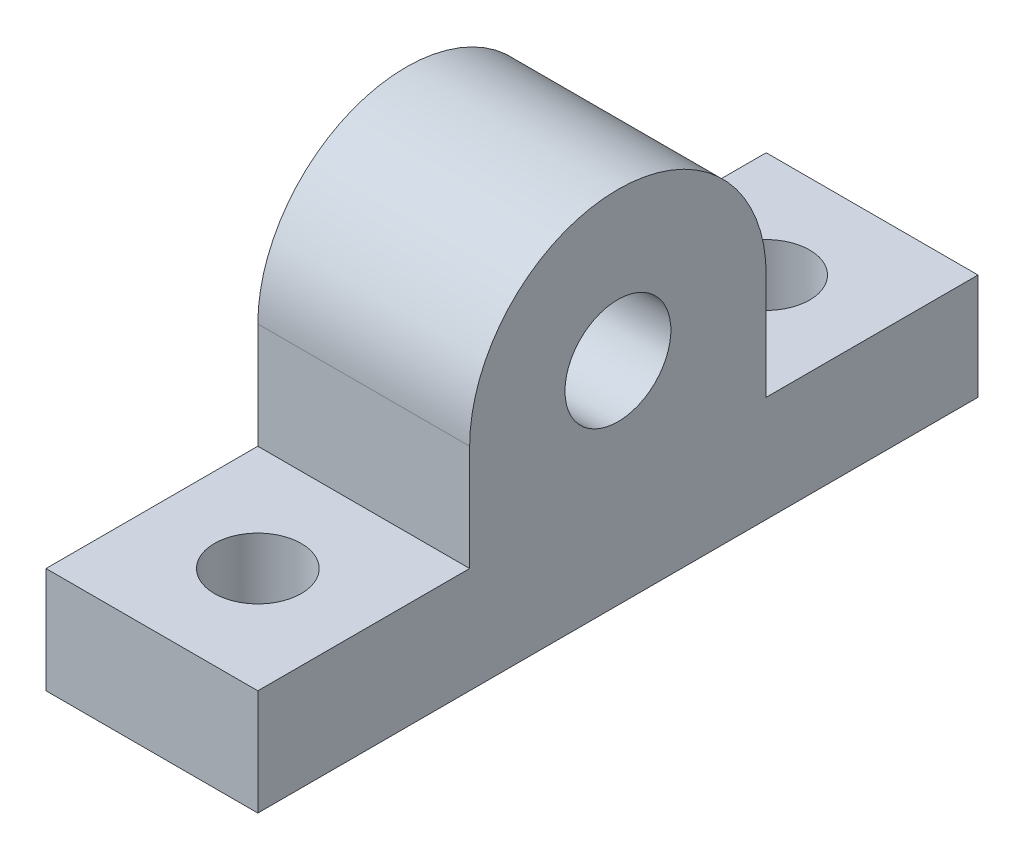
ISO-10303-21;
HEADER;
FILE_DESCRIPTION(('STEP AP214'),'2;1');
FILE_NAME('part.step','',(''),(''),'','','');
FILE_SCHEMA(('AUTOMOTIVE_DESIGN { 1 0 10303 214 1 1 1 1 }'));
ENDSEC;
DATA;
#1=APPLICATION_CONTEXT('core data for automotive mechanical design processes');
#2=APPLICATION_PROTOCOL_DEFINITION('international standard','automotive_design',2000,#1);
#3=PRODUCT_CONTEXT('',#1,'mechanical');
#4=PRODUCT('Part','Part','',(#3));
#5=PRODUCT_RELATED_PRODUCT_CATEGORY('part','',(#4));
#6=PRODUCT_DEFINITION_FORMATION('','',#4);
#7=PRODUCT_DEFINITION_CONTEXT('part definition',#1,'design');
#8=PRODUCT_DEFINITION('design','',#6,#7);
#9=PRODUCT_DEFINITION_SHAPE('','',#8);
#10=(LENGTH_UNIT() NAMED_UNIT(*) SI_UNIT(.MILLI.,.METRE.));
#11=(NAMED_UNIT(*) PLANE_ANGLE_UNIT() SI_UNIT($,.RADIAN.));
#12=(NAMED_UNIT(*) SI_UNIT($,.STERADIAN.) SOLID_ANGLE_UNIT());
#13=UNCERTAINTY_MEASURE_WITH_UNIT(LENGTH_MEASURE(1.E-05),#10,'distance_accuracy_value','');
#14=(GEOMETRIC_REPRESENTATION_CONTEXT(3) GLOBAL_UNCERTAINTY_ASSIGNED_CONTEXT((#13)) GLOBAL_UNIT_ASSIGNED_CONTEXT((#10,
#11,#12)) REPRESENTATION_CONTEXT('',''));
#15=CARTESIAN_POINT('',(0.,0.,0.));
#16=DIRECTION('',(0.,0.,1.));
#17=DIRECTION('',(1.,0.,0.));
#18=AXIS2_PLACEMENT_3D('',#15,#16,#17);
#19=CARTESIAN_POINT('',(10.,10.,0.));
#20=DIRECTION('',(-1.,0.,0.));
#21=DIRECTION('',(0.,0.,1.));
#22=AXIS2_PLACEMENT_3D('',#19,#20,#21);
#23=PLANE('',#22);
#24=DIRECTION('',(0.,-1.,0.));
#25=VECTOR('',#24,1.);
#26=CARTESIAN_POINT('',(10.,0.,17.));
#27=LINE('',#26,#25);
#28=CARTESIAN_POINT('',(10.,5.,17.));
#29=VERTEX_POINT('',#28);
#30=CARTESIAN_POINT('',(10.,0.,17.));
#31=VERTEX_POINT('',#30);
#32=EDGE_CURVE('E148',#29,#31,#27,.T.);
#33=ORIENTED_EDGE('',*,*,#32,.T.);
#34=DIRECTION('',(0.,0.,-1.));
#35=VECTOR('',#34,1.);
#36=CARTESIAN_POINT('',(10.,0.,-17.));
#37=LINE('',#36,#35);
#38=CARTESIAN_POINT('',(10.,0.,-17.));
#39=VERTEX_POINT('',#38);
#40=EDGE_CURVE('E96',#31,#39,#37,.T.);
#41=ORIENTED_EDGE('',*,*,#40,.T.);
#42=DIRECTION('',(0.,1.,0.));
#43=VECTOR('',#42,1.);
#44=CARTESIAN_POINT('',(10.,0.,-17.));
#45=LINE('',#44,#43);
#46=CARTESIAN_POINT('',(10.,5.,-17.));
#47=VERTEX_POINT('',#46);
#48=EDGE_CURVE('E180',#39,#47,#45,.T.);
#49=ORIENTED_EDGE('',*,*,#48,.T.);
#50=DIRECTION('',(0.,0.,1.));
#51=VECTOR('',#50,1.);
#52=CARTESIAN_POINT('',(10.,5.,-17.));
#53=LINE('',#52,#51);
#54=CARTESIAN_POINT('',(10.,5.,-7.));
#55=VERTEX_POINT('',#54);
#56=EDGE_CURVE('E182',#47,#55,#53,.T.);
#57=ORIENTED_EDGE('',*,*,#56,.T.);
#58=DIRECTION('',(0.,1.,0.));
#59=VECTOR('',#58,1.);
#60=CARTESIAN_POINT('',(10.,5.,-7.));
#61=LINE('',#60,#59);
#62=CARTESIAN_POINT('',(10.,10.,-7.));
#63=VERTEX_POINT('',#62);
#64=EDGE_CURVE('E115',#55,#63,#61,.T.);
#65=ORIENTED_EDGE('',*,*,#64,.T.);
#66=CARTESIAN_POINT('',(10.,10.,0.));
#67=DIRECTION('',(1.,0.,0.));
#68=DIRECTION('',(0.,0.,1.));
#69=AXIS2_PLACEMENT_3D('',#66,#67,#68);
#70=CIRCLE('',#69,7.);
#71=CARTESIAN_POINT('',(10.,10.,7.));
#72=VERTEX_POINT('',#71);
#73=EDGE_CURVE('E109',#63,#72,#70,.T.);
#74=ORIENTED_EDGE('',*,*,#73,.T.);
#75=DIRECTION('',(0.,-1.,0.));
#76=VECTOR('',#75,1.);
#77=CARTESIAN_POINT('',(10.,5.,7.));
#78=LINE('',#77,#76);
#79=CARTESIAN_POINT('',(10.,5.,7.));
#80=VERTEX_POINT('',#79);
#81=EDGE_CURVE('E113',#72,#80,#78,.T.);
#82=ORIENTED_EDGE('',*,*,#81,.T.);
#83=DIRECTION('',(0.,0.,1.));
#84=VECTOR('',#83,1.);
#85=CARTESIAN_POINT('',(10.,5.,17.));
#86=LINE('',#85,#84);
#87=EDGE_CURVE('E53',#80,#29,#86,.T.);
#88=ORIENTED_EDGE('',*,*,#87,.T.);
#89=EDGE_LOOP('',(#33,#41,#49,#57,#65,#74,#82,#88));
#90=FACE_BOUND('',#89,.T.);
#91=CARTESIAN_POINT('',(10.,10.,0.));
#92=DIRECTION('',(1.,0.,0.));
#93=DIRECTION('',(0.,0.,1.));
#94=AXIS2_PLACEMENT_3D('',#91,#92,#93);
#95=CIRCLE('',#94,2.5);
#96=CARTESIAN_POINT('',(10.,10.,2.5));
#97=VERTEX_POINT('',#96);
#98=EDGE_CURVE('E137',#97,#97,#95,.T.);
#99=ORIENTED_EDGE('',*,*,#98,.F.);
#100=EDGE_LOOP('',(#99));
#101=FACE_BOUND('',#100,.T.);
#102=ADVANCED_FACE('F34',(#90,#101),#23,.F.);
#103=CARTESIAN_POINT('',(0.,10.,0.));
#104=DIRECTION('',(-1.,0.,0.));
#105=DIRECTION('',(0.,0.,1.));
#106=AXIS2_PLACEMENT_3D('',#103,#104,#105);
#107=PLANE('',#106);
#108=DIRECTION('',(0.,-1.,0.));
#109=VECTOR('',#108,1.);
#110=CARTESIAN_POINT('',(0.,0.,17.));
#111=LINE('',#110,#109);
#112=CARTESIAN_POINT('',(0.,5.,17.));
#113=VERTEX_POINT('',#112);
#114=CARTESIAN_POINT('',(0.,0.,17.));
#115=VERTEX_POINT('',#114);
#116=EDGE_CURVE('E133',#113,#115,#111,.T.);
#117=ORIENTED_EDGE('',*,*,#116,.F.);
#118=DIRECTION('',(0.,0.,1.));
#119=VECTOR('',#118,1.);
#120=CARTESIAN_POINT('',(0.,5.,17.));
#121=LINE('',#120,#119);
#122=CARTESIAN_POINT('',(0.,5.,7.));
#123=VERTEX_POINT('',#122);
#124=EDGE_CURVE('E88',#123,#113,#121,.T.);
#125=ORIENTED_EDGE('',*,*,#124,.F.);
#126=DIRECTION('',(0.,-1.,0.));
#127=VECTOR('',#126,1.);
#128=CARTESIAN_POINT('',(0.,5.,7.));
#129=LINE('',#128,#127);
#130=CARTESIAN_POINT('',(0.,10.,7.));
#131=VERTEX_POINT('',#130);
#132=EDGE_CURVE('E82',#131,#123,#129,.T.);
#133=ORIENTED_EDGE('',*,*,#132,.F.);
#134=CARTESIAN_POINT('',(0.,10.,0.));
#135=DIRECTION('',(1.,0.,0.));
#136=DIRECTION('',(0.,0.,1.));
#137=AXIS2_PLACEMENT_3D('',#134,#135,#136);
#138=CIRCLE('',#137,7.);
#139=CARTESIAN_POINT('',(0.,10.,-7.));
#140=VERTEX_POINT('',#139);
#141=EDGE_CURVE('E123',#140,#131,#138,.T.);
#142=ORIENTED_EDGE('',*,*,#141,.F.);
#143=DIRECTION('',(0.,1.,0.));
#144=VECTOR('',#143,1.);
#145=CARTESIAN_POINT('',(0.,5.,-7.));
#146=LINE('',#145,#144);
#147=CARTESIAN_POINT('',(0.,5.,-7.));
#148=VERTEX_POINT('',#147);
#149=EDGE_CURVE('E143',#148,#140,#146,.T.);
#150=ORIENTED_EDGE('',*,*,#149,.F.);
#151=DIRECTION('',(0.,0.,1.));
#152=VECTOR('',#151,1.);
#153=CARTESIAN_POINT('',(0.,5.,-17.));
#154=LINE('',#153,#152);
#155=CARTESIAN_POINT('',(0.,5.,-17.));
#156=VERTEX_POINT('',#155);
#157=EDGE_CURVE('E141',#156,#148,#154,.T.);
#158=ORIENTED_EDGE('',*,*,#157,.F.);
#159=DIRECTION('',(0.,1.,0.));
#160=VECTOR('',#159,1.);
#161=CARTESIAN_POINT('',(0.,0.,-17.));
#162=LINE('',#161,#160);
#163=CARTESIAN_POINT('',(0.,0.,-17.));
#164=VERTEX_POINT('',#163);
#165=EDGE_CURVE('E139',#164,#156,#162,.T.);
#166=ORIENTED_EDGE('',*,*,#165,.F.);
#167=DIRECTION('',(0.,0.,-1.));
#168=VECTOR('',#167,1.);
#169=CARTESIAN_POINT('',(0.,0.,-17.));
#170=LINE('',#169,#168);
#171=EDGE_CURVE('E136',#115,#164,#170,.T.);
#172=ORIENTED_EDGE('',*,*,#171,.F.);
#173=EDGE_LOOP('',(#117,#125,#133,#142,#150,#158,#166,#172));
#174=FACE_BOUND('',#173,.T.);
#175=CARTESIAN_POINT('',(0.,10.,0.));
#176=DIRECTION('',(1.,0.,0.));
#177=DIRECTION('',(0.,0.,1.));
#178=AXIS2_PLACEMENT_3D('',#175,#176,#177);
#179=CIRCLE('',#178,2.5);
#180=CARTESIAN_POINT('',(0.,10.,2.5));
#181=VERTEX_POINT('',#180);
#182=EDGE_CURVE('E165',#181,#181,#179,.T.);
#183=ORIENTED_EDGE('',*,*,#182,.T.);
#184=EDGE_LOOP('',(#183));
#185=FACE_BOUND('',#184,.T.);
#186=ADVANCED_FACE('F195',(#174,#185),#107,.T.);
#187=CARTESIAN_POINT('',(10.,0.,17.));
#188=DIRECTION('',(0.,0.,-1.));
#189=DIRECTION('',(-1.,0.,0.));
#190=AXIS2_PLACEMENT_3D('',#187,#188,#189);
#191=PLANE('',#190);
#192=ORIENTED_EDGE('',*,*,#116,.T.);
#193=DIRECTION('',(-1.,0.,0.));
#194=VECTOR('',#193,1.);
#195=CARTESIAN_POINT('',(10.,0.,17.));
#196=LINE('',#195,#194);
#197=EDGE_CURVE('E11',#31,#115,#196,.T.);
#198=ORIENTED_EDGE('',*,*,#197,.F.);
#199=ORIENTED_EDGE('',*,*,#32,.F.);
#200=DIRECTION('',(-1.,0.,0.));
#201=VECTOR('',#200,1.);
#202=CARTESIAN_POINT('',(10.,5.,17.));
#203=LINE('',#202,#201);
#204=EDGE_CURVE('E129',#29,#113,#203,.T.);
#205=ORIENTED_EDGE('',*,*,#204,.T.);
#206=EDGE_LOOP('',(#192,#198,#199,#205));
#207=FACE_BOUND('',#206,.T.);
#208=ADVANCED_FACE('F36',(#207),#191,.F.);
#209=CARTESIAN_POINT('',(10.,0.,-17.));
#210=DIRECTION('',(0.,1.,0.));
#211=DIRECTION('',(0.,0.,1.));
#212=AXIS2_PLACEMENT_3D('',#209,#210,#211);
#213=PLANE('',#212);
#214=CARTESIAN_POINT('',(5.,0.,12.));
#215=DIRECTION('',(0.,1.,0.));
#216=DIRECTION('',(0.,0.,1.));
#217=AXIS2_PLACEMENT_3D('',#214,#215,#216);
#218=CIRCLE('',#217,2.05);
#219=CARTESIAN_POINT('',(5.,0.,14.05));
#220=VERTEX_POINT('',#219);
#221=EDGE_CURVE('E161',#220,#220,#218,.T.);
#222=ORIENTED_EDGE('',*,*,#221,.T.);
#223=EDGE_LOOP('',(#222));
#224=FACE_BOUND('',#223,.T.);
#225=CARTESIAN_POINT('',(5.,0.,-12.));
#226=DIRECTION('',(0.,1.,0.));
#227=DIRECTION('',(0.,0.,1.));
#228=AXIS2_PLACEMENT_3D('',#225,#226,#227);
#229=CIRCLE('',#228,2.05);
#230=CARTESIAN_POINT('',(5.,0.,-9.95));
#231=VERTEX_POINT('',#230);
#232=EDGE_CURVE('E167',#231,#231,#229,.T.);
#233=ORIENTED_EDGE('',*,*,#232,.T.);
#234=EDGE_LOOP('',(#233));
#235=FACE_BOUND('',#234,.T.);
#236=ORIENTED_EDGE('',*,*,#171,.T.);
#237=DIRECTION('',(-1.,0.,0.));
#238=VECTOR('',#237,1.);
#239=CARTESIAN_POINT('',(10.,0.,-17.));
#240=LINE('',#239,#238);
#241=EDGE_CURVE('E44',#39,#164,#240,.T.);
#242=ORIENTED_EDGE('',*,*,#241,.F.);
#243=ORIENTED_EDGE('',*,*,#40,.F.);
#244=ORIENTED_EDGE('',*,*,#197,.T.);
#245=EDGE_LOOP('',(#236,#242,#243,#244));
#246=FACE_BOUND('',#245,.T.);
#247=ADVANCED_FACE('F284',(#224,#235,#246),#213,.F.);
#248=CARTESIAN_POINT('',(10.,0.,-17.));
#249=DIRECTION('',(0.,0.,1.));
#250=DIRECTION('',(1.,0.,0.));
#251=AXIS2_PLACEMENT_3D('',#248,#249,#250);
#252=PLANE('',#251);
#253=ORIENTED_EDGE('',*,*,#165,.T.);
#254=DIRECTION('',(-1.,0.,0.));
#255=VECTOR('',#254,1.);
#256=CARTESIAN_POINT('',(10.,5.,-17.));
#257=LINE('',#256,#255);
#258=EDGE_CURVE('E155',#47,#156,#257,.T.);
#259=ORIENTED_EDGE('',*,*,#258,.F.);
#260=ORIENTED_EDGE('',*,*,#48,.F.);
#261=ORIENTED_EDGE('',*,*,#241,.T.);
#262=EDGE_LOOP('',(#253,#259,#260,#261));
#263=FACE_BOUND('',#262,.T.);
#264=ADVANCED_FACE('F276',(#263),#252,.F.);
#265=CARTESIAN_POINT('',(10.,5.,-17.));
#266=DIRECTION('',(0.,-1.,0.));
#267=DIRECTION('',(0.,0.,-1.));
#268=AXIS2_PLACEMENT_3D('',#265,#266,#267);
#269=PLANE('',#268);
#270=CARTESIAN_POINT('',(5.,5.,-12.));
#271=DIRECTION('',(0.,-1.,0.));
#272=DIRECTION('',(0.,0.,-1.));
#273=AXIS2_PLACEMENT_3D('',#270,#271,#272);
#274=CIRCLE('',#273,2.05);
#275=CARTESIAN_POINT('',(5.,5.,-14.05));
#276=VERTEX_POINT('',#275);
#277=EDGE_CURVE('E38',#276,#276,#274,.T.);
#278=ORIENTED_EDGE('',*,*,#277,.T.);
#279=EDGE_LOOP('',(#278));
#280=FACE_BOUND('',#279,.T.);
#281=ORIENTED_EDGE('',*,*,#157,.T.);
#282=DIRECTION('',(-1.,0.,0.));
#283=VECTOR('',#282,1.);
#284=CARTESIAN_POINT('',(10.,5.,-7.));
#285=LINE('',#284,#283);
#286=EDGE_CURVE('E152',#55,#148,#285,.T.);
#287=ORIENTED_EDGE('',*,*,#286,.F.);
#288=ORIENTED_EDGE('',*,*,#56,.F.);
#289=ORIENTED_EDGE('',*,*,#258,.T.);
#290=EDGE_LOOP('',(#281,#287,#288,#289));
#291=FACE_BOUND('',#290,.T.);
#292=ADVANCED_FACE('F188',(#280,#291),#269,.F.);
#293=CARTESIAN_POINT('',(10.,5.,-7.));
#294=DIRECTION('',(0.,0.,1.));
#295=DIRECTION('',(0.,-1.,0.));
#296=AXIS2_PLACEMENT_3D('',#293,#294,#295);
#297=PLANE('',#296);
#298=ORIENTED_EDGE('',*,*,#149,.T.);
#299=DIRECTION('',(-1.,0.,0.));
#300=VECTOR('',#299,1.);
#301=CARTESIAN_POINT('',(10.,10.,-7.));
#302=LINE('',#301,#300);
#303=EDGE_CURVE('E124',#63,#140,#302,.T.);
#304=ORIENTED_EDGE('',*,*,#303,.F.);
#305=ORIENTED_EDGE('',*,*,#64,.F.);
#306=ORIENTED_EDGE('',*,*,#286,.T.);
#307=EDGE_LOOP('',(#298,#304,#305,#306));
#308=FACE_BOUND('',#307,.T.);
#309=ADVANCED_FACE('F192',(#308),#297,.F.);
#310=CARTESIAN_POINT('',(10.,10.,0.));
#311=DIRECTION('',(-1.,0.,0.));
#312=DIRECTION('',(0.,0.,1.));
#313=AXIS2_PLACEMENT_3D('',#310,#311,#312);
#314=CYLINDRICAL_SURFACE('',#313,7.);
#315=ORIENTED_EDGE('',*,*,#141,.T.);
#316=DIRECTION('',(-1.,0.,0.));
#317=VECTOR('',#316,1.);
#318=CARTESIAN_POINT('',(10.,10.,7.));
#319=LINE('',#318,#317);
#320=EDGE_CURVE('E120',#72,#131,#319,.T.);
#321=ORIENTED_EDGE('',*,*,#320,.F.);
#322=ORIENTED_EDGE('',*,*,#73,.F.);
#323=ORIENTED_EDGE('',*,*,#303,.T.);
#324=EDGE_LOOP('',(#315,#321,#322,#323));
#325=FACE_BOUND('',#324,.T.);
#326=ADVANCED_FACE('F121',(#325),#314,.T.);
#327=CARTESIAN_POINT('',(10.,5.,7.));
#328=DIRECTION('',(0.,0.,-1.));
#329=DIRECTION('',(0.,1.,0.));
#330=AXIS2_PLACEMENT_3D('',#327,#328,#329);
#331=PLANE('',#330);
#332=ORIENTED_EDGE('',*,*,#132,.T.);
#333=DIRECTION('',(-1.,0.,0.));
#334=VECTOR('',#333,1.);
#335=CARTESIAN_POINT('',(10.,5.,7.));
#336=LINE('',#335,#334);
#337=EDGE_CURVE('E125',#80,#123,#336,.T.);
#338=ORIENTED_EDGE('',*,*,#337,.F.);
#339=ORIENTED_EDGE('',*,*,#81,.F.);
#340=ORIENTED_EDGE('',*,*,#320,.T.);
#341=EDGE_LOOP('',(#332,#338,#339,#340));
#342=FACE_BOUND('',#341,.T.);
#343=ADVANCED_FACE('F127',(#342),#331,.F.);
#344=CARTESIAN_POINT('',(10.,5.,17.));
#345=DIRECTION('',(0.,-1.,0.));
#346=DIRECTION('',(0.,0.,-1.));
#347=AXIS2_PLACEMENT_3D('',#344,#345,#346);
#348=PLANE('',#347);
#349=CARTESIAN_POINT('',(5.,5.,12.));
#350=DIRECTION('',(0.,-1.,0.));
#351=DIRECTION('',(0.,0.,-1.));
#352=AXIS2_PLACEMENT_3D('',#349,#350,#351);
#353=CIRCLE('',#352,2.05);
#354=CARTESIAN_POINT('',(5.,5.,9.95));
#355=VERTEX_POINT('',#354);
#356=EDGE_CURVE('E159',#355,#355,#353,.T.);
#357=ORIENTED_EDGE('',*,*,#356,.T.);
#358=EDGE_LOOP('',(#357));
#359=FACE_BOUND('',#358,.T.);
#360=ORIENTED_EDGE('',*,*,#124,.T.);
#361=ORIENTED_EDGE('',*,*,#204,.F.);
#362=ORIENTED_EDGE('',*,*,#87,.F.);
#363=ORIENTED_EDGE('',*,*,#337,.T.);
#364=EDGE_LOOP('',(#360,#361,#362,#363));
#365=FACE_BOUND('',#364,.T.);
#366=ADVANCED_FACE('F201',(#359,#365),#348,.F.);
#367=CARTESIAN_POINT('',(10.,10.,0.));
#368=DIRECTION('',(-1.,0.,0.));
#369=DIRECTION('',(0.,0.,1.));
#370=AXIS2_PLACEMENT_3D('',#367,#368,#369);
#371=CYLINDRICAL_SURFACE('',#370,2.5);
#372=ORIENTED_EDGE('',*,*,#98,.T.);
#373=EDGE_LOOP('',(#372));
#374=FACE_BOUND('',#373,.T.);
#375=ORIENTED_EDGE('',*,*,#182,.F.);
#376=EDGE_LOOP('',(#375));
#377=FACE_BOUND('',#376,.T.);
#378=ADVANCED_FACE('F203',(#374,#377),#371,.F.);
#379=CARTESIAN_POINT('',(5.,0.,12.));
#380=DIRECTION('',(0.,1.,0.));
#381=DIRECTION('',(0.,0.,1.));
#382=AXIS2_PLACEMENT_3D('',#379,#380,#381);
#383=CYLINDRICAL_SURFACE('',#382,2.05);
#384=ORIENTED_EDGE('',*,*,#221,.F.);
#385=EDGE_LOOP('',(#384));
#386=FACE_BOUND('',#385,.T.);
#387=ORIENTED_EDGE('',*,*,#356,.F.);
#388=EDGE_LOOP('',(#387));
#389=FACE_BOUND('',#388,.T.);
#390=ADVANCED_FACE('F209',(#386,#389),#383,.F.);
#391=CARTESIAN_POINT('',(5.,0.,-12.));
#392=DIRECTION('',(0.,1.,0.));
#393=DIRECTION('',(0.,0.,1.));
#394=AXIS2_PLACEMENT_3D('',#391,#392,#393);
#395=CYLINDRICAL_SURFACE('',#394,2.05);
#396=ORIENTED_EDGE('',*,*,#232,.F.);
#397=EDGE_LOOP('',(#396));
#398=FACE_BOUND('',#397,.T.);
#399=ORIENTED_EDGE('',*,*,#277,.F.);
#400=EDGE_LOOP('',(#399));
#401=FACE_BOUND('',#400,.T.);
#402=ADVANCED_FACE('F220',(#398,#401),#395,.F.);
#403=CLOSED_SHELL('',(#102,#186,#208,#247,#264,#292,#309,#326,#343,#366,#378,#390,#402));
#404=MANIFOLD_SOLID_BREP('B2',#403);
#405=ADVANCED_BREP_SHAPE_REPRESENTATION('',(#18,#404),#14);
#406=SHAPE_DEFINITION_REPRESENTATION(#9,#405);
ENDSEC;
END-ISO-10303-21;
